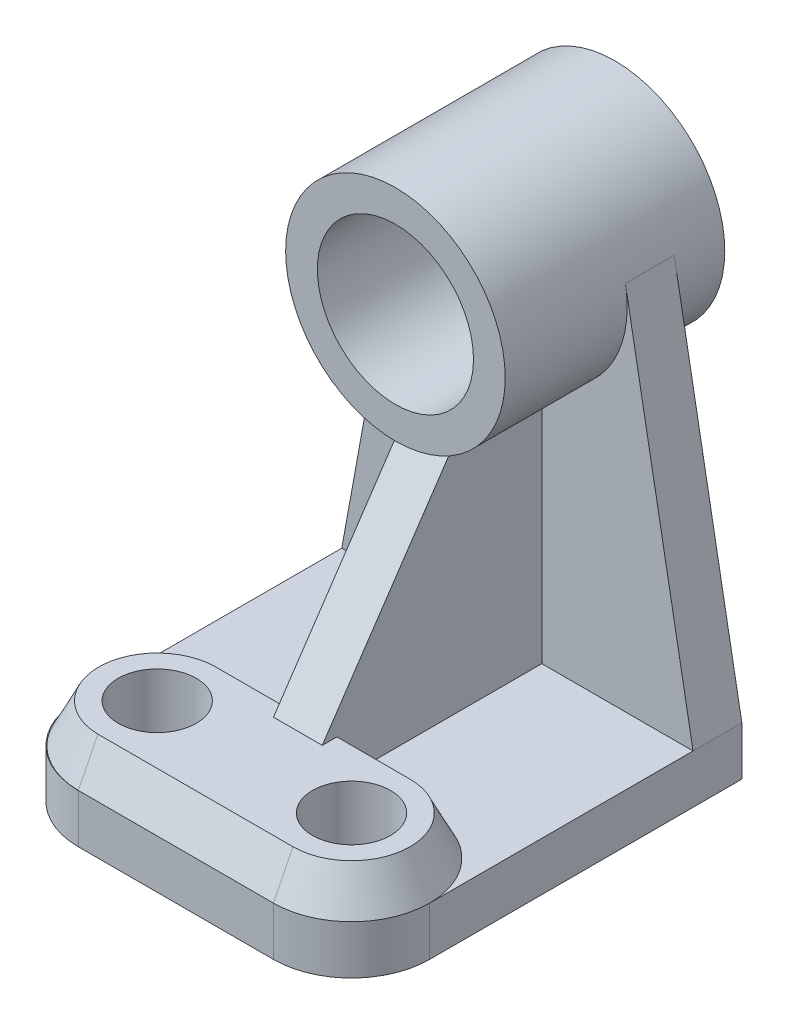
ISO-10303-21;
HEADER;
FILE_DESCRIPTION(('STEP AP214'),'2;1');
FILE_NAME('part.step','',(''),(''),'','','');
FILE_SCHEMA(('AUTOMOTIVE_DESIGN { 1 0 10303 214 1 1 1 1 }'));
ENDSEC;
DATA;
#1=APPLICATION_CONTEXT('core data for automotive mechanical design processes');
#2=APPLICATION_PROTOCOL_DEFINITION('international standard','automotive_design',2000,#1);
#3=PRODUCT_CONTEXT('',#1,'mechanical');
#4=PRODUCT('Part','Part','',(#3));
#5=PRODUCT_RELATED_PRODUCT_CATEGORY('part','',(#4));
#6=PRODUCT_DEFINITION_FORMATION('','',#4);
#7=PRODUCT_DEFINITION_CONTEXT('part definition',#1,'design');
#8=PRODUCT_DEFINITION('design','',#6,#7);
#9=PRODUCT_DEFINITION_SHAPE('','',#8);
#10=(LENGTH_UNIT() NAMED_UNIT(*) SI_UNIT(.MILLI.,.METRE.));
#11=(NAMED_UNIT(*) PLANE_ANGLE_UNIT() SI_UNIT($,.RADIAN.));
#12=(NAMED_UNIT(*) SI_UNIT($,.STERADIAN.) SOLID_ANGLE_UNIT());
#13=UNCERTAINTY_MEASURE_WITH_UNIT(LENGTH_MEASURE(1.E-05),#10,'distance_accuracy_value','');
#14=(GEOMETRIC_REPRESENTATION_CONTEXT(3) GLOBAL_UNCERTAINTY_ASSIGNED_CONTEXT((#13)) GLOBAL_UNIT_ASSIGNED_CONTEXT((#10,
#11,#12)) REPRESENTATION_CONTEXT('',''));
#15=CARTESIAN_POINT('',(0.,0.,0.));
#16=DIRECTION('',(0.,0.,1.));
#17=DIRECTION('',(1.,0.,0.));
#18=AXIS2_PLACEMENT_3D('',#15,#16,#17);
#19=CARTESIAN_POINT('',(0.,5.,80.));
#20=DIRECTION('',(0.,1.,0.));
#21=DIRECTION('',(0.,0.,1.));
#22=AXIS2_PLACEMENT_3D('',#19,#20,#21);
#23=PLANE('',#22);
#24=DIRECTION('',(-1.,0.,0.));
#25=VECTOR('',#24,1.);
#26=CARTESIAN_POINT('',(-20.,5.,48.));
#27=LINE('',#26,#25);
#28=CARTESIAN_POINT('',(-5.,5.,48.));
#29=VERTEX_POINT('',#28);
#30=CARTESIAN_POINT('',(-20.,5.,48.));
#31=VERTEX_POINT('',#30);
#32=EDGE_CURVE('E253',#29,#31,#27,.T.);
#33=ORIENTED_EDGE('',*,*,#32,.F.);
#34=DIRECTION('',(0.,0.,-1.));
#35=VECTOR('',#34,1.);
#36=CARTESIAN_POINT('',(-5.,5.,80.));
#37=LINE('',#36,#35);
#38=CARTESIAN_POINT('',(-5.,5.,9.99999999999999));
#39=VERTEX_POINT('',#38);
#40=EDGE_CURVE('E69',#29,#39,#37,.T.);
#41=ORIENTED_EDGE('',*,*,#40,.T.);
#42=DIRECTION('',(1.,0.,0.));
#43=VECTOR('',#42,1.);
#44=CARTESIAN_POINT('',(0.,5.,10.));
#45=LINE('',#44,#43);
#46=CARTESIAN_POINT('',(-36.,5.,9.99999999999999));
#47=VERTEX_POINT('',#46);
#48=EDGE_CURVE('E277',#47,#39,#45,.T.);
#49=ORIENTED_EDGE('',*,*,#48,.F.);
#50=DIRECTION('',(0.,0.,-1.));
#51=VECTOR('',#50,1.);
#52=CARTESIAN_POINT('',(-36.,5.,80.));
#53=LINE('',#52,#51);
#54=CARTESIAN_POINT('',(-36.,5.,64.));
#55=VERTEX_POINT('',#54);
#56=EDGE_CURVE('E334',#55,#47,#53,.T.);
#57=ORIENTED_EDGE('',*,*,#56,.F.);
#58=CARTESIAN_POINT('',(-20.,5.,64.));
#59=DIRECTION('',(0.,1.,0.));
#60=DIRECTION('',(0.,0.,1.));
#61=AXIS2_PLACEMENT_3D('',#58,#59,#60);
#62=CIRCLE('',#61,16.);
#63=CARTESIAN_POINT('',(-19.9999999999998,5.,80.));
#64=VERTEX_POINT('',#63);
#65=EDGE_CURVE('E341',#55,#64,#62,.T.);
#66=ORIENTED_EDGE('',*,*,#65,.T.);
#67=CARTESIAN_POINT('',(-19.8162587626736,5.,64.));
#68=DIRECTION('',(0.,1.,0.));
#69=DIRECTION('',(0.,0.,1.));
#70=AXIS2_PLACEMENT_3D('',#67,#68,#69);
#71=CIRCLE('',#70,16.0010549915402);
#72=EDGE_CURVE('E245',#31,#64,#71,.T.);
#73=ORIENTED_EDGE('',*,*,#72,.F.);
#74=EDGE_LOOP('',(#33,#41,#49,#57,#66,#73));
#75=FACE_BOUND('',#74,.T.);
#76=ADVANCED_FACE('F51',(#75),#23,.T.);
#77=CARTESIAN_POINT('',(0.,0.,10.));
#78=DIRECTION('',(0.,0.,1.));
#79=DIRECTION('',(1.,0.,0.));
#80=AXIS2_PLACEMENT_3D('',#77,#78,#79);
#81=PLANE('',#80);
#82=ORIENTED_EDGE('',*,*,#48,.T.);
#83=DIRECTION('',(0.,1.,0.));
#84=VECTOR('',#83,1.);
#85=CARTESIAN_POINT('',(-5.,0.,10.));
#86=LINE('',#85,#84);
#87=CARTESIAN_POINT('',(-5.,55.0625890315197,10.));
#88=VERTEX_POINT('',#87);
#89=EDGE_CURVE('E217',#39,#88,#86,.T.);
#90=ORIENTED_EDGE('',*,*,#89,.T.);
#91=CARTESIAN_POINT('',(0.,77.,10.));
#92=DIRECTION('',(0.,0.,1.));
#93=DIRECTION('',(1.,0.,0.));
#94=AXIS2_PLACEMENT_3D('',#91,#92,#93);
#95=CIRCLE('',#94,22.5);
#96=CARTESIAN_POINT('',(-22.1350095419824,81.0362547709912,10.));
#97=VERTEX_POINT('',#96);
#98=EDGE_CURVE('E267',#97,#88,#95,.T.);
#99=ORIENTED_EDGE('',*,*,#98,.F.);
#100=DIRECTION('',(-0.179389100932942,-0.983778201865883,0.));
#101=VECTOR('',#100,1.);
#102=CARTESIAN_POINT('',(-35.7238992525437,6.51414938507293,10.));
#103=LINE('',#102,#101);
#104=EDGE_CURVE('E271',#97,#47,#103,.T.);
#105=ORIENTED_EDGE('',*,*,#104,.T.);
#106=EDGE_LOOP('',(#82,#90,#99,#105));
#107=FACE_BOUND('',#106,.T.);
#108=ADVANCED_FACE('F418',(#107),#81,.T.);
#109=CARTESIAN_POINT('',(-19.8162587626736,13.,52.));
#110=DIRECTION('',(0.,0.447213595499955,-0.894427190999917));
#111=DIRECTION('',(1.,0.,0.));
#112=AXIS2_PLACEMENT_3D('',#109,#110,#111);
#113=PLANE('',#112);
#114=DIRECTION('',(-1.,0.,0.));
#115=VECTOR('',#114,1.);
#116=CARTESIAN_POINT('',(-20.,13.,52.));
#117=LINE('',#116,#115);
#118=CARTESIAN_POINT('',(-5.,13.,52.));
#119=VERTEX_POINT('',#118);
#120=CARTESIAN_POINT('',(-19.9753842162387,13.,52.));
#121=VERTEX_POINT('',#120);
#122=EDGE_CURVE('E367',#119,#121,#117,.T.);
#123=ORIENTED_EDGE('',*,*,#122,.F.);
#124=DIRECTION('',(0.,-0.894427190999917,-0.447213595499956));
#125=VECTOR('',#124,1.);
#126=CARTESIAN_POINT('',(-5.,13.,52.));
#127=LINE('',#126,#125);
#128=EDGE_CURVE('E184',#119,#29,#127,.T.);
#129=ORIENTED_EDGE('',*,*,#128,.T.);
#130=ORIENTED_EDGE('',*,*,#32,.T.);
#131=CARTESIAN_POINT('',(-19.9753842162387,13.,52.));
#132=CARTESIAN_POINT('',(-19.9797810104898,11.6666673889158,51.3333336944579));
#133=CARTESIAN_POINT('',(-19.9840307229314,10.3333344157781,50.6666672078891));
#134=CARTESIAN_POINT('',(-19.9922359841843,7.66666774911142,49.3333338745557));
#135=CARTESIAN_POINT('',(-19.9961915329964,6.33333405558238,48.6666670277912));
#136=CARTESIAN_POINT('',(-19.9999999999998,4.99999999999994,48.));
#137=B_SPLINE_CURVE_WITH_KNOTS('',3,(#131,#132,#133,#134,#135,#136),.UNSPECIFIED.,.F.,.F.,(4,2,
4),(0.,4.47215291941513,8.94430582636837),.UNSPECIFIED.);
#138=EDGE_CURVE('E382',#31,#121,#137,.F.);
#139=ORIENTED_EDGE('',*,*,#138,.T.);
#140=EDGE_LOOP('',(#123,#129,#130,#139));
#141=FACE_BOUND('',#140,.T.);
#142=ADVANCED_FACE('F408',(#141),#113,.T.);
#143=DIRECTION('',(0.,0.,-1.));
#144=VECTOR('',#143,1.);
#145=CARTESIAN_POINT('',(5.,5.,80.));
#146=LINE('',#145,#144);
#147=CARTESIAN_POINT('',(5.,5.,48.));
#148=VERTEX_POINT('',#147);
#149=CARTESIAN_POINT('',(5.,5.,9.99999999999999));
#150=VERTEX_POINT('',#149);
#151=EDGE_CURVE('E210',#148,#150,#146,.T.);
#152=ORIENTED_EDGE('',*,*,#151,.F.);
#153=CARTESIAN_POINT('',(20.,5.,48.));
#154=VERTEX_POINT('',#153);
#155=EDGE_CURVE('E254',#154,#148,#27,.T.);
#156=ORIENTED_EDGE('',*,*,#155,.F.);
#157=CARTESIAN_POINT('',(20.,5.,64.));
#158=DIRECTION('',(0.,1.,0.));
#159=DIRECTION('',(0.,0.,1.));
#160=AXIS2_PLACEMENT_3D('',#157,#158,#159);
#161=CIRCLE('',#160,16.);
#162=CARTESIAN_POINT('',(36.,5.,64.));
#163=VERTEX_POINT('',#162);
#164=EDGE_CURVE('E249',#163,#154,#161,.T.);
#165=ORIENTED_EDGE('',*,*,#164,.F.);
#166=DIRECTION('',(0.,0.,-1.));
#167=VECTOR('',#166,1.);
#168=CARTESIAN_POINT('',(36.,5.,80.));
#169=LINE('',#168,#167);
#170=CARTESIAN_POINT('',(36.,5.,10.));
#171=VERTEX_POINT('',#170);
#172=EDGE_CURVE('E314',#163,#171,#169,.T.);
#173=ORIENTED_EDGE('',*,*,#172,.T.);
#174=EDGE_CURVE('E276',#150,#171,#45,.T.);
#175=ORIENTED_EDGE('',*,*,#174,.F.);
#176=EDGE_LOOP('',(#152,#156,#165,#173,#175));
#177=FACE_BOUND('',#176,.T.);
#178=ADVANCED_FACE('F417',(#177),#23,.T.);
#179=CARTESIAN_POINT('',(-36.,0.,80.));
#180=DIRECTION('',(-1.,0.,0.));
#181=DIRECTION('',(0.,0.,1.));
#182=AXIS2_PLACEMENT_3D('',#179,#180,#181);
#183=PLANE('',#182);
#184=DIRECTION('',(0.,0.,-1.));
#185=VECTOR('',#184,1.);
#186=CARTESIAN_POINT('',(-36.,-5.,80.));
#187=LINE('',#186,#185);
#188=CARTESIAN_POINT('',(-36.,-5.,64.));
#189=VERTEX_POINT('',#188);
#190=CARTESIAN_POINT('',(-36.,-5.,0.));
#191=VERTEX_POINT('',#190);
#192=EDGE_CURVE('E331',#189,#191,#187,.T.);
#193=ORIENTED_EDGE('',*,*,#192,.F.);
#194=DIRECTION('',(0.,1.,0.));
#195=VECTOR('',#194,1.);
#196=CARTESIAN_POINT('',(-36.,0.,64.));
#197=LINE('',#196,#195);
#198=EDGE_CURVE('E337',#189,#55,#197,.T.);
#199=ORIENTED_EDGE('',*,*,#198,.T.);
#200=ORIENTED_EDGE('',*,*,#56,.T.);
#201=DIRECTION('',(0.,0.,-1.));
#202=VECTOR('',#201,1.);
#203=CARTESIAN_POINT('',(-36.,5.,10.));
#204=LINE('',#203,#202);
#205=CARTESIAN_POINT('',(-36.,5.,0.));
#206=VERTEX_POINT('',#205);
#207=EDGE_CURVE('E303',#47,#206,#204,.T.);
#208=ORIENTED_EDGE('',*,*,#207,.T.);
#209=DIRECTION('',(0.,1.,0.));
#210=VECTOR('',#209,1.);
#211=CARTESIAN_POINT('',(-36.,0.,0.));
#212=LINE('',#211,#210);
#213=EDGE_CURVE('E309',#191,#206,#212,.T.);
#214=ORIENTED_EDGE('',*,*,#213,.F.);
#215=EDGE_LOOP('',(#193,#199,#200,#208,#214));
#216=FACE_BOUND('',#215,.T.);
#217=ADVANCED_FACE('F434',(#216),#183,.T.);
#218=CARTESIAN_POINT('',(0.,-5.,80.));
#219=DIRECTION('',(0.,1.,0.));
#220=DIRECTION('',(0.,0.,1.));
#221=AXIS2_PLACEMENT_3D('',#218,#219,#220);
#222=PLANE('',#221);
#223=DIRECTION('',(1.,0.,0.));
#224=VECTOR('',#223,1.);
#225=CARTESIAN_POINT('',(0.,-5.,0.));
#226=LINE('',#225,#224);
#227=CARTESIAN_POINT('',(36.,-5.,0.));
#228=VERTEX_POINT('',#227);
#229=EDGE_CURVE('E319',#191,#228,#226,.T.);
#230=ORIENTED_EDGE('',*,*,#229,.T.);
#231=DIRECTION('',(0.,0.,-1.));
#232=VECTOR('',#231,1.);
#233=CARTESIAN_POINT('',(36.,-5.,80.));
#234=LINE('',#233,#232);
#235=CARTESIAN_POINT('',(36.,-5.,64.));
#236=VERTEX_POINT('',#235);
#237=EDGE_CURVE('E327',#236,#228,#234,.T.);
#238=ORIENTED_EDGE('',*,*,#237,.F.);
#239=CARTESIAN_POINT('',(20.,-5.,64.));
#240=DIRECTION('',(0.,1.,0.));
#241=DIRECTION('',(0.,0.,1.));
#242=AXIS2_PLACEMENT_3D('',#239,#240,#241);
#243=CIRCLE('',#242,16.);
#244=CARTESIAN_POINT('',(20.,-5.,80.));
#245=VERTEX_POINT('',#244);
#246=EDGE_CURVE('E352',#236,#245,#243,.F.);
#247=ORIENTED_EDGE('',*,*,#246,.T.);
#248=DIRECTION('',(1.,0.,0.));
#249=VECTOR('',#248,1.);
#250=CARTESIAN_POINT('',(0.,-5.,80.));
#251=LINE('',#250,#249);
#252=CARTESIAN_POINT('',(-20.,-5.,80.));
#253=VERTEX_POINT('',#252);
#254=EDGE_CURVE('E310',#253,#245,#251,.T.);
#255=ORIENTED_EDGE('',*,*,#254,.F.);
#256=CARTESIAN_POINT('',(-20.,-5.,64.));
#257=DIRECTION('',(0.,1.,0.));
#258=DIRECTION('',(0.,0.,1.));
#259=AXIS2_PLACEMENT_3D('',#256,#257,#258);
#260=CIRCLE('',#259,16.);
#261=EDGE_CURVE('E355',#253,#189,#260,.F.);
#262=ORIENTED_EDGE('',*,*,#261,.T.);
#263=ORIENTED_EDGE('',*,*,#192,.T.);
#264=EDGE_LOOP('',(#230,#238,#247,#255,#262,#263));
#265=FACE_BOUND('',#264,.T.);
#266=CARTESIAN_POINT('',(-19.8162587626736,-5.,64.));
#267=DIRECTION('',(0.,1.,0.));
#268=DIRECTION('',(0.,0.,1.));
#269=AXIS2_PLACEMENT_3D('',#266,#267,#268);
#270=CIRCLE('',#269,8.);
#271=CARTESIAN_POINT('',(-19.8162587626736,-5.,72.));
#272=VERTEX_POINT('',#271);
#273=EDGE_CURVE('E229',#272,#272,#270,.T.);
#274=ORIENTED_EDGE('',*,*,#273,.T.);
#275=EDGE_LOOP('',(#274));
#276=FACE_BOUND('',#275,.T.);
#277=CARTESIAN_POINT('',(20.,-5.,64.));
#278=DIRECTION('',(0.,1.,0.));
#279=DIRECTION('',(0.,0.,1.));
#280=AXIS2_PLACEMENT_3D('',#277,#278,#279);
#281=CIRCLE('',#280,8.);
#282=CARTESIAN_POINT('',(20.,-5.,72.));
#283=VERTEX_POINT('',#282);
#284=EDGE_CURVE('E228',#283,#283,#281,.T.);
#285=ORIENTED_EDGE('',*,*,#284,.T.);
#286=EDGE_LOOP('',(#285));
#287=FACE_BOUND('',#286,.T.);
#288=ADVANCED_FACE('F440',(#265,#276,#287),#222,.F.);
#289=CARTESIAN_POINT('',(36.,0.,80.));
#290=DIRECTION('',(-1.,0.,0.));
#291=DIRECTION('',(0.,0.,1.));
#292=AXIS2_PLACEMENT_3D('',#289,#290,#291);
#293=PLANE('',#292);
#294=ORIENTED_EDGE('',*,*,#172,.F.);
#295=DIRECTION('',(0.,1.,0.));
#296=VECTOR('',#295,1.);
#297=CARTESIAN_POINT('',(36.,-5.,64.));
#298=LINE('',#297,#296);
#299=EDGE_CURVE('E358',#163,#236,#298,.F.);
#300=ORIENTED_EDGE('',*,*,#299,.T.);
#301=ORIENTED_EDGE('',*,*,#237,.T.);
#302=DIRECTION('',(0.,1.,0.));
#303=VECTOR('',#302,1.);
#304=CARTESIAN_POINT('',(36.,0.,0.));
#305=LINE('',#304,#303);
#306=CARTESIAN_POINT('',(36.,5.,0.));
#307=VERTEX_POINT('',#306);
#308=EDGE_CURVE('E315',#228,#307,#305,.T.);
#309=ORIENTED_EDGE('',*,*,#308,.T.);
#310=DIRECTION('',(0.,0.,-1.));
#311=VECTOR('',#310,1.);
#312=CARTESIAN_POINT('',(36.,5.,10.));
#313=LINE('',#312,#311);
#314=EDGE_CURVE('E299',#171,#307,#313,.T.);
#315=ORIENTED_EDGE('',*,*,#314,.F.);
#316=EDGE_LOOP('',(#294,#300,#301,#309,#315));
#317=FACE_BOUND('',#316,.T.);
#318=ADVANCED_FACE('F473',(#317),#293,.F.);
#319=CARTESIAN_POINT('',(0.,0.,80.));
#320=DIRECTION('',(0.,0.,1.));
#321=DIRECTION('',(1.,0.,0.));
#322=AXIS2_PLACEMENT_3D('',#319,#320,#321);
#323=PLANE('',#322);
#324=DIRECTION('',(0.,1.,0.));
#325=VECTOR('',#324,1.);
#326=CARTESIAN_POINT('',(20.,5.,80.));
#327=LINE('',#326,#325);
#328=CARTESIAN_POINT('',(20.,5.,80.));
#329=VERTEX_POINT('',#328);
#330=EDGE_CURVE('E345',#245,#329,#327,.T.);
#331=ORIENTED_EDGE('',*,*,#330,.T.);
#332=DIRECTION('',(-1.,0.,0.));
#333=VECTOR('',#332,1.);
#334=CARTESIAN_POINT('',(0.,4.99999999999994,80.));
#335=LINE('',#334,#333);
#336=EDGE_CURVE('E373',#329,#64,#335,.T.);
#337=ORIENTED_EDGE('',*,*,#336,.T.);
#338=DIRECTION('',(0.,1.,0.));
#339=VECTOR('',#338,1.);
#340=CARTESIAN_POINT('',(-20.,0.,80.));
#341=LINE('',#340,#339);
#342=EDGE_CURVE('E349',#64,#253,#341,.F.);
#343=ORIENTED_EDGE('',*,*,#342,.T.);
#344=ORIENTED_EDGE('',*,*,#254,.T.);
#345=EDGE_LOOP('',(#331,#337,#343,#344));
#346=FACE_BOUND('',#345,.T.);
#347=ADVANCED_FACE('F452',(#346),#323,.T.);
#348=CARTESIAN_POINT('',(0.,0.,0.));
#349=DIRECTION('',(0.,0.,1.));
#350=DIRECTION('',(1.,0.,0.));
#351=AXIS2_PLACEMENT_3D('',#348,#349,#350);
#352=PLANE('',#351);
#353=ORIENTED_EDGE('',*,*,#308,.F.);
#354=ORIENTED_EDGE('',*,*,#229,.F.);
#355=ORIENTED_EDGE('',*,*,#213,.T.);
#356=DIRECTION('',(-0.179389100932942,-0.983778201865883,0.));
#357=VECTOR('',#356,1.);
#358=CARTESIAN_POINT('',(-35.7238992525437,6.51414938507293,0.));
#359=LINE('',#358,#357);
#360=CARTESIAN_POINT('',(-22.1350095419824,81.0362547709912,0.));
#361=VERTEX_POINT('',#360);
#362=EDGE_CURVE('E288',#361,#206,#359,.T.);
#363=ORIENTED_EDGE('',*,*,#362,.F.);
#364=CARTESIAN_POINT('',(0.,77.,0.));
#365=DIRECTION('',(0.,0.,1.));
#366=DIRECTION('',(1.,0.,0.));
#367=AXIS2_PLACEMENT_3D('',#364,#365,#366);
#368=CIRCLE('',#367,22.5);
#369=CARTESIAN_POINT('',(22.1350095419824,81.0362547709912,0.));
#370=VERTEX_POINT('',#369);
#371=EDGE_CURVE('E266',#361,#370,#368,.T.);
#372=ORIENTED_EDGE('',*,*,#371,.T.);
#373=DIRECTION('',(0.179389100932942,-0.983778201865883,0.));
#374=VECTOR('',#373,1.);
#375=CARTESIAN_POINT('',(35.7238992525437,6.51414938507294,0.));
#376=LINE('',#375,#374);
#377=EDGE_CURVE('E292',#370,#307,#376,.T.);
#378=ORIENTED_EDGE('',*,*,#377,.T.);
#379=EDGE_LOOP('',(#353,#354,#355,#363,#372,#378));
#380=FACE_BOUND('',#379,.T.);
#381=ADVANCED_FACE('F483',(#380),#352,.F.);
#382=CARTESIAN_POINT('',(-35.7238992525437,6.51414938507293,10.));
#383=DIRECTION('',(0.983778201865883,-0.179389100932942,0.));
#384=DIRECTION('',(0.179389100932942,0.983778201865883,0.));
#385=AXIS2_PLACEMENT_3D('',#382,#383,#384);
#386=PLANE('',#385);
#387=ORIENTED_EDGE('',*,*,#362,.T.);
#388=ORIENTED_EDGE('',*,*,#207,.F.);
#389=ORIENTED_EDGE('',*,*,#104,.F.);
#390=DIRECTION('',(0.,0.,-1.));
#391=VECTOR('',#390,1.);
#392=CARTESIAN_POINT('',(-22.1350095419824,81.0362547709912,10.));
#393=LINE('',#392,#391);
#394=EDGE_CURVE('E306',#97,#361,#393,.T.);
#395=ORIENTED_EDGE('',*,*,#394,.T.);
#396=EDGE_LOOP('',(#387,#388,#389,#395));
#397=FACE_BOUND('',#396,.T.);
#398=ADVANCED_FACE('F538',(#397),#386,.F.);
#399=CARTESIAN_POINT('',(35.7238992525437,6.51414938507294,10.));
#400=DIRECTION('',(0.983778201865883,0.179389100932942,0.));
#401=DIRECTION('',(-0.179389100932942,0.983778201865883,0.));
#402=AXIS2_PLACEMENT_3D('',#399,#400,#401);
#403=PLANE('',#402);
#404=ORIENTED_EDGE('',*,*,#377,.F.);
#405=DIRECTION('',(0.,0.,-1.));
#406=VECTOR('',#405,1.);
#407=CARTESIAN_POINT('',(22.1350095419824,81.0362547709912,10.));
#408=LINE('',#407,#406);
#409=CARTESIAN_POINT('',(22.1350095419824,81.0362547709912,10.));
#410=VERTEX_POINT('',#409);
#411=EDGE_CURVE('E285',#410,#370,#408,.T.);
#412=ORIENTED_EDGE('',*,*,#411,.F.);
#413=DIRECTION('',(0.179389100932942,-0.983778201865883,0.));
#414=VECTOR('',#413,1.);
#415=CARTESIAN_POINT('',(35.7238992525437,6.51414938507294,10.));
#416=LINE('',#415,#414);
#417=EDGE_CURVE('E281',#410,#171,#416,.T.);
#418=ORIENTED_EDGE('',*,*,#417,.T.);
#419=ORIENTED_EDGE('',*,*,#314,.T.);
#420=EDGE_LOOP('',(#404,#412,#418,#419));
#421=FACE_BOUND('',#420,.T.);
#422=ADVANCED_FACE('F490',(#421),#403,.T.);
#423=DIRECTION('',(0.,1.,0.));
#424=VECTOR('',#423,1.);
#425=CARTESIAN_POINT('',(5.,0.,10.));
#426=LINE('',#425,#424);
#427=CARTESIAN_POINT('',(5.,55.0625890315197,10.));
#428=VERTEX_POINT('',#427);
#429=EDGE_CURVE('E215',#150,#428,#426,.T.);
#430=ORIENTED_EDGE('',*,*,#429,.F.);
#431=ORIENTED_EDGE('',*,*,#174,.T.);
#432=ORIENTED_EDGE('',*,*,#417,.F.);
#433=EDGE_CURVE('E272',#428,#410,#95,.T.);
#434=ORIENTED_EDGE('',*,*,#433,.F.);
#435=EDGE_LOOP('',(#430,#431,#432,#434));
#436=FACE_BOUND('',#435,.T.);
#437=ADVANCED_FACE('F429',(#436),#81,.T.);
#438=CARTESIAN_POINT('',(0.,77.,-10.));
#439=DIRECTION('',(0.,0.,1.));
#440=DIRECTION('',(1.,0.,0.));
#441=AXIS2_PLACEMENT_3D('',#438,#439,#440);
#442=CYLINDRICAL_SURFACE('',#441,22.5);
#443=CARTESIAN_POINT('',(0.,77.,-10.));
#444=DIRECTION('',(0.,0.,1.));
#445=DIRECTION('',(1.,0.,0.));
#446=AXIS2_PLACEMENT_3D('',#443,#444,#445);
#447=CIRCLE('',#446,22.5);
#448=CARTESIAN_POINT('',(22.5,77.,-10.));
#449=VERTEX_POINT('',#448);
#450=EDGE_CURVE('E262',#449,#449,#447,.T.);
#451=ORIENTED_EDGE('',*,*,#450,.T.);
#452=EDGE_LOOP('',(#451));
#453=FACE_BOUND('',#452,.T.);
#454=ORIENTED_EDGE('',*,*,#411,.T.);
#455=ORIENTED_EDGE('',*,*,#371,.F.);
#456=ORIENTED_EDGE('',*,*,#394,.F.);
#457=ORIENTED_EDGE('',*,*,#98,.T.);
#458=DIRECTION('',(0.,0.,1.));
#459=VECTOR('',#458,1.);
#460=CARTESIAN_POINT('',(-5.,55.0625890315197,-10.));
#461=LINE('',#460,#459);
#462=CARTESIAN_POINT('',(-5.,55.0625890315197,26.6204218582518));
#463=VERTEX_POINT('',#462);
#464=EDGE_CURVE('E211',#88,#463,#461,.T.);
#465=ORIENTED_EDGE('',*,*,#464,.T.);
#466=CARTESIAN_POINT('',(0.,77.,11.8192771084337));
#467=DIRECTION('',(0.,-0.559301309771593,-0.828964441268611));
#468=DIRECTION('',(0.,-0.828964441268611,0.559301309771593));
#469=AXIS2_PLACEMENT_3D('',#466,#467,#468);
#470=ELLIPSE('',#469,27.1422981250764,22.5);
#471=CARTESIAN_POINT('',(5.,55.0625890315197,26.6204218582518));
#472=VERTEX_POINT('',#471);
#473=EDGE_CURVE('E196',#472,#463,#470,.T.);
#474=ORIENTED_EDGE('',*,*,#473,.F.);
#475=DIRECTION('',(0.,0.,1.));
#476=VECTOR('',#475,1.);
#477=CARTESIAN_POINT('',(5.,55.0625890315197,-10.));
#478=LINE('',#477,#476);
#479=EDGE_CURVE('E223',#428,#472,#478,.T.);
#480=ORIENTED_EDGE('',*,*,#479,.F.);
#481=ORIENTED_EDGE('',*,*,#433,.T.);
#482=EDGE_LOOP('',(#454,#455,#456,#457,#465,#474,#480,#481));
#483=FACE_BOUND('',#482,.T.);
#484=CARTESIAN_POINT('',(0.,77.,35.));
#485=DIRECTION('',(0.,0.,1.));
#486=DIRECTION('',(1.,0.,0.));
#487=AXIS2_PLACEMENT_3D('',#484,#485,#486);
#488=CIRCLE('',#487,22.5);
#489=CARTESIAN_POINT('',(22.5,77.,35.));
#490=VERTEX_POINT('',#489);
#491=EDGE_CURVE('E258',#490,#490,#488,.T.);
#492=ORIENTED_EDGE('',*,*,#491,.F.);
#493=EDGE_LOOP('',(#492));
#494=FACE_BOUND('',#493,.T.);
#495=ADVANCED_FACE('F492',(#453,#483,#494),#442,.T.);
#496=CARTESIAN_POINT('',(0.,0.,-10.));
#497=DIRECTION('',(0.,0.,1.));
#498=DIRECTION('',(1.,0.,0.));
#499=AXIS2_PLACEMENT_3D('',#496,#497,#498);
#500=PLANE('',#499);
#501=CARTESIAN_POINT('',(0.,77.,-10.));
#502=DIRECTION('',(0.,0.,1.));
#503=DIRECTION('',(1.,0.,0.));
#504=AXIS2_PLACEMENT_3D('',#501,#502,#503);
#505=CIRCLE('',#504,12.);
#506=CARTESIAN_POINT('',(12.,77.,-10.));
#507=VERTEX_POINT('',#506);
#508=EDGE_CURVE('E198',#507,#507,#505,.T.);
#509=ORIENTED_EDGE('',*,*,#508,.T.);
#510=EDGE_LOOP('',(#509));
#511=FACE_BOUND('',#510,.T.);
#512=ORIENTED_EDGE('',*,*,#450,.F.);
#513=EDGE_LOOP('',(#512));
#514=FACE_BOUND('',#513,.T.);
#515=ADVANCED_FACE('F527',(#511,#514),#500,.F.);
#516=CARTESIAN_POINT('',(0.,0.,35.));
#517=DIRECTION('',(0.,0.,1.));
#518=DIRECTION('',(1.,0.,0.));
#519=AXIS2_PLACEMENT_3D('',#516,#517,#518);
#520=PLANE('',#519);
#521=CARTESIAN_POINT('',(0.,77.,35.));
#522=DIRECTION('',(0.,0.,1.));
#523=DIRECTION('',(1.,0.,0.));
#524=AXIS2_PLACEMENT_3D('',#521,#522,#523);
#525=CIRCLE('',#524,16.);
#526=CARTESIAN_POINT('',(16.,77.,35.));
#527=VERTEX_POINT('',#526);
#528=EDGE_CURVE('E750',#527,#527,#525,.T.);
#529=ORIENTED_EDGE('',*,*,#528,.F.);
#530=EDGE_LOOP('',(#529));
#531=FACE_BOUND('',#530,.T.);
#532=ORIENTED_EDGE('',*,*,#491,.T.);
#533=EDGE_LOOP('',(#532));
#534=FACE_BOUND('',#533,.T.);
#535=ADVANCED_FACE('F524',(#531,#534),#520,.T.);
#536=CARTESIAN_POINT('',(-19.8162587626736,13.,64.));
#537=DIRECTION('',(0.,1.,0.));
#538=DIRECTION('',(0.,0.,1.));
#539=AXIS2_PLACEMENT_3D('',#536,#537,#538);
#540=PLANE('',#539);
#541=DIRECTION('',(0.,0.,-1.));
#542=VECTOR('',#541,1.);
#543=CARTESIAN_POINT('',(5.,13.,64.));
#544=LINE('',#543,#542);
#545=CARTESIAN_POINT('',(5.,13.,55.));
#546=VERTEX_POINT('',#545);
#547=CARTESIAN_POINT('',(5.,13.,52.));
#548=VERTEX_POINT('',#547);
#549=EDGE_CURVE('E204',#546,#548,#544,.T.);
#550=ORIENTED_EDGE('',*,*,#549,.F.);
#551=DIRECTION('',(-1.,0.,0.));
#552=VECTOR('',#551,1.);
#553=CARTESIAN_POINT('',(-19.8162587626736,13.,55.));
#554=LINE('',#553,#552);
#555=CARTESIAN_POINT('',(-5.,13.,55.));
#556=VERTEX_POINT('',#555);
#557=EDGE_CURVE('E11',#556,#546,#554,.F.);
#558=ORIENTED_EDGE('',*,*,#557,.F.);
#559=DIRECTION('',(0.,0.,-1.));
#560=VECTOR('',#559,1.);
#561=CARTESIAN_POINT('',(-5.,13.,64.));
#562=LINE('',#561,#560);
#563=EDGE_CURVE('E179',#556,#119,#562,.T.);
#564=ORIENTED_EDGE('',*,*,#563,.T.);
#565=ORIENTED_EDGE('',*,*,#122,.T.);
#566=CARTESIAN_POINT('',(-19.8162587626736,13.,64.));
#567=DIRECTION('',(0.,1.,0.));
#568=DIRECTION('',(0.,0.,1.));
#569=AXIS2_PLACEMENT_3D('',#566,#567,#568);
#570=CIRCLE('',#569,12.0010549915402);
#571=CARTESIAN_POINT('',(-19.9753842162386,13.,76.));
#572=VERTEX_POINT('',#571);
#573=EDGE_CURVE('E364',#121,#572,#570,.T.);
#574=ORIENTED_EDGE('',*,*,#573,.T.);
#575=DIRECTION('',(1.,0.,0.));
#576=VECTOR('',#575,1.);
#577=CARTESIAN_POINT('',(-19.8162587626736,13.,76.));
#578=LINE('',#577,#576);
#579=CARTESIAN_POINT('',(20.,13.,76.));
#580=VERTEX_POINT('',#579);
#581=EDGE_CURVE('E361',#572,#580,#578,.T.);
#582=ORIENTED_EDGE('',*,*,#581,.T.);
#583=CARTESIAN_POINT('',(20.,13.,64.));
#584=DIRECTION('',(0.,1.,0.));
#585=DIRECTION('',(0.,0.,1.));
#586=AXIS2_PLACEMENT_3D('',#583,#584,#585);
#587=CIRCLE('',#586,12.);
#588=CARTESIAN_POINT('',(20.,13.,52.));
#589=VERTEX_POINT('',#588);
#590=EDGE_CURVE('E370',#580,#589,#587,.T.);
#591=ORIENTED_EDGE('',*,*,#590,.T.);
#592=EDGE_CURVE('E206',#589,#548,#117,.T.);
#593=ORIENTED_EDGE('',*,*,#592,.T.);
#594=EDGE_LOOP('',(#550,#558,#564,#565,#574,#582,#591,#593));
#595=FACE_BOUND('',#594,.T.);
#596=CARTESIAN_POINT('',(20.,13.,64.));
#597=DIRECTION('',(0.,1.,0.));
#598=DIRECTION('',(0.,0.,1.));
#599=AXIS2_PLACEMENT_3D('',#596,#597,#598);
#600=CIRCLE('',#599,8.);
#601=CARTESIAN_POINT('',(20.,13.,72.));
#602=VERTEX_POINT('',#601);
#603=EDGE_CURVE('E240',#602,#602,#600,.T.);
#604=ORIENTED_EDGE('',*,*,#603,.F.);
#605=EDGE_LOOP('',(#604));
#606=FACE_BOUND('',#605,.T.);
#607=CARTESIAN_POINT('',(-19.8162587626736,13.,64.));
#608=DIRECTION('',(0.,1.,0.));
#609=DIRECTION('',(0.,0.,1.));
#610=AXIS2_PLACEMENT_3D('',#607,#608,#609);
#611=CIRCLE('',#610,8.);
#612=CARTESIAN_POINT('',(-19.8162587626736,13.,72.));
#613=VERTEX_POINT('',#612);
#614=EDGE_CURVE('E236',#613,#613,#611,.T.);
#615=ORIENTED_EDGE('',*,*,#614,.F.);
#616=EDGE_LOOP('',(#615));
#617=FACE_BOUND('',#616,.T.);
#618=ADVANCED_FACE('F201',(#595,#606,#617),#540,.T.);
#619=CARTESIAN_POINT('',(20.,13.,64.));
#620=DIRECTION('',(0.,-1.,0.));
#621=DIRECTION('',(0.,0.,-1.));
#622=AXIS2_PLACEMENT_3D('',#619,#620,#621);
#623=CYLINDRICAL_SURFACE('',#622,8.);
#624=ORIENTED_EDGE('',*,*,#603,.T.);
#625=EDGE_LOOP('',(#624));
#626=FACE_BOUND('',#625,.T.);
#627=ORIENTED_EDGE('',*,*,#284,.F.);
#628=EDGE_LOOP('',(#627));
#629=FACE_BOUND('',#628,.T.);
#630=ADVANCED_FACE('F518',(#626,#629),#623,.F.);
#631=CARTESIAN_POINT('',(-19.8162587626736,13.,64.));
#632=DIRECTION('',(0.,-1.,0.));
#633=DIRECTION('',(0.,0.,-1.));
#634=AXIS2_PLACEMENT_3D('',#631,#632,#633);
#635=CYLINDRICAL_SURFACE('',#634,8.);
#636=ORIENTED_EDGE('',*,*,#614,.T.);
#637=EDGE_LOOP('',(#636));
#638=FACE_BOUND('',#637,.T.);
#639=ORIENTED_EDGE('',*,*,#273,.F.);
#640=EDGE_LOOP('',(#639));
#641=FACE_BOUND('',#640,.T.);
#642=ADVANCED_FACE('F516',(#638,#641),#635,.F.);
#643=CARTESIAN_POINT('',(-20.,0.,64.));
#644=DIRECTION('',(0.,1.,0.));
#645=DIRECTION('',(0.,0.,1.));
#646=AXIS2_PLACEMENT_3D('',#643,#644,#645);
#647=CYLINDRICAL_SURFACE('',#646,16.);
#648=ORIENTED_EDGE('',*,*,#261,.F.);
#649=ORIENTED_EDGE('',*,*,#342,.F.);
#650=ORIENTED_EDGE('',*,*,#65,.F.);
#651=ORIENTED_EDGE('',*,*,#198,.F.);
#652=EDGE_LOOP('',(#648,#649,#650,#651));
#653=FACE_BOUND('',#652,.T.);
#654=ADVANCED_FACE('F463',(#653),#647,.T.);
#655=CARTESIAN_POINT('',(20.,0.,64.));
#656=DIRECTION('',(0.,-1.,0.));
#657=DIRECTION('',(0.,0.,-1.));
#658=AXIS2_PLACEMENT_3D('',#655,#656,#657);
#659=CYLINDRICAL_SURFACE('',#658,16.);
#660=ORIENTED_EDGE('',*,*,#246,.F.);
#661=ORIENTED_EDGE('',*,*,#299,.F.);
#662=EDGE_CURVE('E250',#329,#163,#161,.T.);
#663=ORIENTED_EDGE('',*,*,#662,.F.);
#664=ORIENTED_EDGE('',*,*,#330,.F.);
#665=EDGE_LOOP('',(#660,#661,#663,#664));
#666=FACE_BOUND('',#665,.T.);
#667=ADVANCED_FACE('F477',(#666),#659,.T.);
#668=CARTESIAN_POINT('',(-19.8162587626736,13.,64.));
#669=DIRECTION('',(0.,-1.,0.));
#670=DIRECTION('',(0.,0.,-1.));
#671=AXIS2_PLACEMENT_3D('',#668,#669,#670);
#672=CONICAL_SURFACE('',#671,12.0010549915402,0.463647609000803);
#673=ORIENTED_EDGE('',*,*,#138,.F.);
#674=ORIENTED_EDGE('',*,*,#72,.T.);
#675=CARTESIAN_POINT('',(-19.9753842162386,13.,76.));
#676=CARTESIAN_POINT('',(-19.9797810104897,11.6666673889158,76.6666663055421));
#677=CARTESIAN_POINT('',(-19.9840307229313,10.3333344157781,77.3333327921109));
#678=CARTESIAN_POINT('',(-19.9922359841842,7.66666774911142,78.6666661254443));
#679=CARTESIAN_POINT('',(-19.9961915329963,6.33333405558238,79.3333329722088));
#680=CARTESIAN_POINT('',(-19.9999999999998,4.99999999999994,80.));
#681=B_SPLINE_CURVE_WITH_KNOTS('',3,(#675,#676,#677,#678,#679,#680),.UNSPECIFIED.,.F.,.F.,(4,2,
4),(0.,4.47215291941513,8.94430582636837),.UNSPECIFIED.);
#682=EDGE_CURVE('E241',#572,#64,#681,.T.);
#683=ORIENTED_EDGE('',*,*,#682,.F.);
#684=ORIENTED_EDGE('',*,*,#573,.F.);
#685=EDGE_LOOP('',(#673,#674,#683,#684));
#686=FACE_BOUND('',#685,.T.);
#687=ADVANCED_FACE('F397',(#686),#672,.T.);
#688=CARTESIAN_POINT('',(-19.8162587626736,13.,76.));
#689=DIRECTION('',(0.,-0.447213595499955,-0.894427190999917));
#690=DIRECTION('',(1.,0.,0.));
#691=AXIS2_PLACEMENT_3D('',#688,#689,#690);
#692=PLANE('',#691);
#693=ORIENTED_EDGE('',*,*,#682,.T.);
#694=ORIENTED_EDGE('',*,*,#336,.F.);
#695=DIRECTION('',(0.,-0.894427190999917,0.447213595499955));
#696=VECTOR('',#695,1.);
#697=CARTESIAN_POINT('',(20.,13.,76.));
#698=LINE('',#697,#696);
#699=EDGE_CURVE('E378',#580,#329,#698,.T.);
#700=ORIENTED_EDGE('',*,*,#699,.F.);
#701=ORIENTED_EDGE('',*,*,#581,.F.);
#702=EDGE_LOOP('',(#693,#694,#700,#701));
#703=FACE_BOUND('',#702,.T.);
#704=ADVANCED_FACE('F54',(#703),#692,.F.);
#705=DIRECTION('',(0.,-0.894427190999917,-0.447213595499956));
#706=VECTOR('',#705,1.);
#707=CARTESIAN_POINT('',(5.,13.,52.));
#708=LINE('',#707,#706);
#709=EDGE_CURVE('E62',#548,#148,#708,.T.);
#710=ORIENTED_EDGE('',*,*,#709,.F.);
#711=ORIENTED_EDGE('',*,*,#592,.F.);
#712=DIRECTION('',(0.,0.894427190999917,0.447213595499955));
#713=VECTOR('',#712,1.);
#714=CARTESIAN_POINT('',(20.,4.99999999999994,48.));
#715=LINE('',#714,#713);
#716=EDGE_CURVE('E77',#154,#589,#715,.T.);
#717=ORIENTED_EDGE('',*,*,#716,.F.);
#718=ORIENTED_EDGE('',*,*,#155,.T.);
#719=EDGE_LOOP('',(#710,#711,#717,#718));
#720=FACE_BOUND('',#719,.T.);
#721=ADVANCED_FACE('F401',(#720),#113,.T.);
#722=CARTESIAN_POINT('',(20.,13.,64.));
#723=DIRECTION('',(0.,-1.,0.));
#724=DIRECTION('',(0.,0.,-1.));
#725=AXIS2_PLACEMENT_3D('',#722,#723,#724);
#726=CONICAL_SURFACE('',#725,12.,0.463647609000803);
#727=ORIENTED_EDGE('',*,*,#662,.T.);
#728=ORIENTED_EDGE('',*,*,#164,.T.);
#729=ORIENTED_EDGE('',*,*,#716,.T.);
#730=ORIENTED_EDGE('',*,*,#590,.F.);
#731=ORIENTED_EDGE('',*,*,#699,.T.);
#732=EDGE_LOOP('',(#727,#728,#729,#730,#731));
#733=FACE_BOUND('',#732,.T.);
#734=ADVANCED_FACE('F406',(#733),#726,.T.);
#735=CARTESIAN_POINT('',(0.,13.,55.));
#736=DIRECTION('',(0.,-0.559301309771593,-0.828964441268611));
#737=DIRECTION('',(0.,0.828964441268611,-0.559301309771593));
#738=AXIS2_PLACEMENT_3D('',#735,#736,#737);
#739=PLANE('',#738);
#740=DIRECTION('',(0.,0.828964441268611,-0.559301309771593));
#741=VECTOR('',#740,1.);
#742=CARTESIAN_POINT('',(5.,13.,55.));
#743=LINE('',#742,#741);
#744=EDGE_CURVE('E189',#546,#472,#743,.T.);
#745=ORIENTED_EDGE('',*,*,#744,.T.);
#746=ORIENTED_EDGE('',*,*,#473,.T.);
#747=DIRECTION('',(0.,0.828964441268611,-0.559301309771593));
#748=VECTOR('',#747,1.);
#749=CARTESIAN_POINT('',(-5.,13.,55.));
#750=LINE('',#749,#748);
#751=EDGE_CURVE('E182',#556,#463,#750,.T.);
#752=ORIENTED_EDGE('',*,*,#751,.F.);
#753=ORIENTED_EDGE('',*,*,#557,.T.);
#754=EDGE_LOOP('',(#745,#746,#752,#753));
#755=FACE_BOUND('',#754,.T.);
#756=ADVANCED_FACE('F193',(#755),#739,.F.);
#757=CARTESIAN_POINT('',(5.,47.25,35.));
#758=DIRECTION('',(1.,0.,0.));
#759=DIRECTION('',(0.,0.,-1.));
#760=AXIS2_PLACEMENT_3D('',#757,#758,#759);
#761=PLANE('',#760);
#762=ORIENTED_EDGE('',*,*,#429,.T.);
#763=ORIENTED_EDGE('',*,*,#479,.T.);
#764=ORIENTED_EDGE('',*,*,#744,.F.);
#765=ORIENTED_EDGE('',*,*,#549,.T.);
#766=ORIENTED_EDGE('',*,*,#709,.T.);
#767=ORIENTED_EDGE('',*,*,#151,.T.);
#768=EDGE_LOOP('',(#762,#763,#764,#765,#766,#767));
#769=FACE_BOUND('',#768,.T.);
#770=ADVANCED_FACE('F504',(#769),#761,.T.);
#771=CARTESIAN_POINT('',(-5.,47.25,35.));
#772=DIRECTION('',(1.,0.,0.));
#773=DIRECTION('',(0.,0.,-1.));
#774=AXIS2_PLACEMENT_3D('',#771,#772,#773);
#775=PLANE('',#774);
#776=ORIENTED_EDGE('',*,*,#464,.F.);
#777=ORIENTED_EDGE('',*,*,#89,.F.);
#778=ORIENTED_EDGE('',*,*,#40,.F.);
#779=ORIENTED_EDGE('',*,*,#128,.F.);
#780=ORIENTED_EDGE('',*,*,#563,.F.);
#781=ORIENTED_EDGE('',*,*,#751,.T.);
#782=EDGE_LOOP('',(#776,#777,#778,#779,#780,#781));
#783=FACE_BOUND('',#782,.T.);
#784=ADVANCED_FACE('F181',(#783),#775,.F.);
#785=CARTESIAN_POINT('',(0.,77.,35.));
#786=DIRECTION('',(0.,0.,1.));
#787=DIRECTION('',(1.,0.,0.));
#788=AXIS2_PLACEMENT_3D('',#785,#786,#787);
#789=CYLINDRICAL_SURFACE('',#788,12.);
#790=ORIENTED_EDGE('',*,*,#508,.F.);
#791=EDGE_LOOP('',(#790));
#792=FACE_BOUND('',#791,.T.);
#793=CARTESIAN_POINT('',(0.,77.,5.));
#794=DIRECTION('',(0.,0.,1.));
#795=DIRECTION('',(1.,0.,0.));
#796=AXIS2_PLACEMENT_3D('',#793,#794,#795);
#797=CIRCLE('',#796,12.);
#798=CARTESIAN_POINT('',(12.,77.,5.));
#799=VERTEX_POINT('',#798);
#800=EDGE_CURVE('E754',#799,#799,#797,.T.);
#801=ORIENTED_EDGE('',*,*,#800,.T.);
#802=EDGE_LOOP('',(#801));
#803=FACE_BOUND('',#802,.T.);
#804=ADVANCED_FACE('F510',(#792,#803),#789,.F.);
#805=CARTESIAN_POINT('',(12.,77.,5.));
#806=DIRECTION('',(0.,0.,-1.));
#807=DIRECTION('',(-1.,0.,0.));
#808=AXIS2_PLACEMENT_3D('',#805,#806,#807);
#809=PLANE('',#808);
#810=ORIENTED_EDGE('',*,*,#800,.F.);
#811=EDGE_LOOP('',(#810));
#812=FACE_BOUND('',#811,.T.);
#813=CARTESIAN_POINT('',(0.,77.,5.));
#814=DIRECTION('',(0.,0.,1.));
#815=DIRECTION('',(1.,0.,0.));
#816=AXIS2_PLACEMENT_3D('',#813,#814,#815);
#817=CIRCLE('',#816,16.);
#818=CARTESIAN_POINT('',(16.,77.,5.));
#819=VERTEX_POINT('',#818);
#820=EDGE_CURVE('E747',#819,#819,#817,.T.);
#821=ORIENTED_EDGE('',*,*,#820,.T.);
#822=EDGE_LOOP('',(#821));
#823=FACE_BOUND('',#822,.T.);
#824=ADVANCED_FACE('F676',(#812,#823),#809,.F.);
#825=CARTESIAN_POINT('',(0.,77.,35.));
#826=DIRECTION('',(0.,0.,1.));
#827=DIRECTION('',(1.,0.,0.));
#828=AXIS2_PLACEMENT_3D('',#825,#826,#827);
#829=CYLINDRICAL_SURFACE('',#828,16.);
#830=ORIENTED_EDGE('',*,*,#820,.F.);
#831=EDGE_LOOP('',(#830));
#832=FACE_BOUND('',#831,.T.);
#833=ORIENTED_EDGE('',*,*,#528,.T.);
#834=EDGE_LOOP('',(#833));
#835=FACE_BOUND('',#834,.T.);
#836=ADVANCED_FACE('F684',(#832,#835),#829,.F.);
#837=CLOSED_SHELL('',(#76,#108,#142,#178,#217,#288,#318,#347,#381,#398,#422,#437,#495,#515,#535,
#618,#630,#642,#654,#667,#687,#704,#721,#734,#756,#770,#784,#804,#824,#836));
#838=MANIFOLD_SOLID_BREP('B2',#837);
#839=ADVANCED_BREP_SHAPE_REPRESENTATION('',(#18,#838),#14);
#840=SHAPE_DEFINITION_REPRESENTATION(#9,#839);
ENDSEC;
END-ISO-10303-21;
